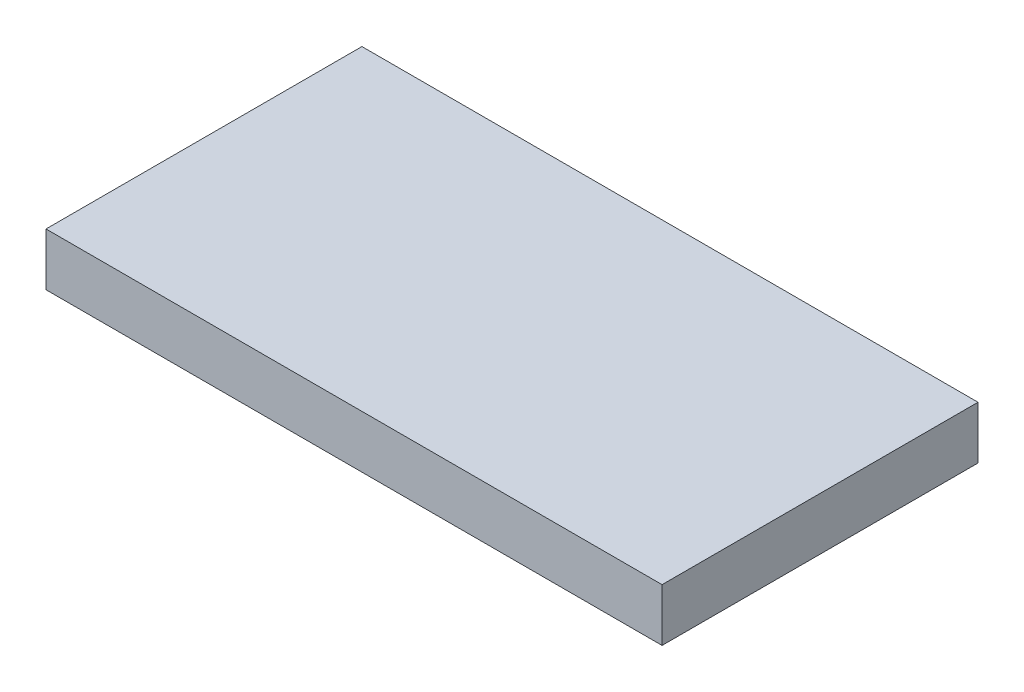
ISO-10303-21;
HEADER;
FILE_DESCRIPTION(('STEP AP214'),'2;1');
FILE_NAME('part.step','',(''),(''),'','','');
FILE_SCHEMA(('AUTOMOTIVE_DESIGN { 1 0 10303 214 1 1 1 1 }'));
ENDSEC;
DATA;
#1=APPLICATION_CONTEXT('core data for automotive mechanical design processes');
#2=APPLICATION_PROTOCOL_DEFINITION('international standard','automotive_design',2000,#1);
#3=PRODUCT_CONTEXT('',#1,'mechanical');
#4=PRODUCT('Part','Part','',(#3));
#5=PRODUCT_RELATED_PRODUCT_CATEGORY('part','',(#4));
#6=PRODUCT_DEFINITION_FORMATION('','',#4);
#7=PRODUCT_DEFINITION_CONTEXT('part definition',#1,'design');
#8=PRODUCT_DEFINITION('design','',#6,#7);
#9=PRODUCT_DEFINITION_SHAPE('','',#8);
#10=(LENGTH_UNIT() NAMED_UNIT(*) SI_UNIT(.MILLI.,.METRE.));
#11=(NAMED_UNIT(*) PLANE_ANGLE_UNIT() SI_UNIT($,.RADIAN.));
#12=(NAMED_UNIT(*) SI_UNIT($,.STERADIAN.) SOLID_ANGLE_UNIT());
#13=UNCERTAINTY_MEASURE_WITH_UNIT(LENGTH_MEASURE(1.E-05),#10,'distance_accuracy_value','');
#14=(GEOMETRIC_REPRESENTATION_CONTEXT(3) GLOBAL_UNCERTAINTY_ASSIGNED_CONTEXT((#13)) GLOBAL_UNIT_ASSIGNED_CONTEXT((#10,
#11,#12)) REPRESENTATION_CONTEXT('',''));
#15=CARTESIAN_POINT('',(0.,0.,0.));
#16=DIRECTION('',(0.,0.,1.));
#17=DIRECTION('',(1.,0.,0.));
#18=AXIS2_PLACEMENT_3D('',#15,#16,#17);
#19=CARTESIAN_POINT('',(0.,2.,0.));
#20=DIRECTION('',(1.,0.,0.));
#21=DIRECTION('',(0.,0.,-1.));
#22=AXIS2_PLACEMENT_3D('',#19,#20,#21);
#23=PLANE('',#22);
#24=DIRECTION('',(0.,0.,1.));
#25=VECTOR('',#24,1.);
#26=CARTESIAN_POINT('',(0.,0.,0.));
#27=LINE('',#26,#25);
#28=CARTESIAN_POINT('',(0.,0.,0.));
#29=VERTEX_POINT('',#28);
#30=CARTESIAN_POINT('',(0.,0.,12.));
#31=VERTEX_POINT('',#30);
#32=EDGE_CURVE('E96',#29,#31,#27,.T.);
#33=ORIENTED_EDGE('',*,*,#32,.T.);
#34=DIRECTION('',(0.,-1.,0.));
#35=VECTOR('',#34,1.);
#36=CARTESIAN_POINT('',(0.,2.,12.));
#37=LINE('',#36,#35);
#38=CARTESIAN_POINT('',(0.,2.,12.));
#39=VERTEX_POINT('',#38);
#40=EDGE_CURVE('E11',#39,#31,#37,.T.);
#41=ORIENTED_EDGE('',*,*,#40,.F.);
#42=DIRECTION('',(0.,0.,1.));
#43=VECTOR('',#42,1.);
#44=CARTESIAN_POINT('',(0.,2.,0.));
#45=LINE('',#44,#43);
#46=CARTESIAN_POINT('',(0.,2.,0.));
#47=VERTEX_POINT('',#46);
#48=EDGE_CURVE('E84',#47,#39,#45,.T.);
#49=ORIENTED_EDGE('',*,*,#48,.F.);
#50=DIRECTION('',(0.,-1.,0.));
#51=VECTOR('',#50,1.);
#52=CARTESIAN_POINT('',(0.,2.,0.));
#53=LINE('',#52,#51);
#54=EDGE_CURVE('E92',#47,#29,#53,.T.);
#55=ORIENTED_EDGE('',*,*,#54,.T.);
#56=EDGE_LOOP('',(#33,#41,#49,#55));
#57=FACE_BOUND('',#56,.T.);
#58=ADVANCED_FACE('F33',(#57),#23,.F.);
#59=CARTESIAN_POINT('',(0.,2.,12.));
#60=DIRECTION('',(0.,0.,-1.));
#61=DIRECTION('',(-1.,0.,0.));
#62=AXIS2_PLACEMENT_3D('',#59,#60,#61);
#63=PLANE('',#62);
#64=DIRECTION('',(1.,0.,0.));
#65=VECTOR('',#64,1.);
#66=CARTESIAN_POINT('',(0.,0.,12.));
#67=LINE('',#66,#65);
#68=CARTESIAN_POINT('',(23.4,0.,12.));
#69=VERTEX_POINT('',#68);
#70=EDGE_CURVE('E88',#31,#69,#67,.T.);
#71=ORIENTED_EDGE('',*,*,#70,.T.);
#72=DIRECTION('',(0.,-1.,0.));
#73=VECTOR('',#72,1.);
#74=CARTESIAN_POINT('',(23.4,2.,12.));
#75=LINE('',#74,#73);
#76=CARTESIAN_POINT('',(23.4,2.,12.));
#77=VERTEX_POINT('',#76);
#78=EDGE_CURVE('E41',#77,#69,#75,.T.);
#79=ORIENTED_EDGE('',*,*,#78,.F.);
#80=DIRECTION('',(1.,0.,0.));
#81=VECTOR('',#80,1.);
#82=CARTESIAN_POINT('',(0.,2.,12.));
#83=LINE('',#82,#81);
#84=EDGE_CURVE('E79',#39,#77,#83,.T.);
#85=ORIENTED_EDGE('',*,*,#84,.F.);
#86=ORIENTED_EDGE('',*,*,#40,.T.);
#87=EDGE_LOOP('',(#71,#79,#85,#86));
#88=FACE_BOUND('',#87,.T.);
#89=ADVANCED_FACE('F87',(#88),#63,.F.);
#90=CARTESIAN_POINT('',(23.4,2.,0.));
#91=DIRECTION('',(-1.,0.,0.));
#92=DIRECTION('',(0.,0.,1.));
#93=AXIS2_PLACEMENT_3D('',#90,#91,#92);
#94=PLANE('',#93);
#95=DIRECTION('',(0.,0.,-1.));
#96=VECTOR('',#95,1.);
#97=CARTESIAN_POINT('',(23.4,0.,0.));
#98=LINE('',#97,#96);
#99=CARTESIAN_POINT('',(23.4,0.,0.));
#100=VERTEX_POINT('',#99);
#101=EDGE_CURVE('E66',#69,#100,#98,.T.);
#102=ORIENTED_EDGE('',*,*,#101,.T.);
#103=DIRECTION('',(0.,-1.,0.));
#104=VECTOR('',#103,1.);
#105=CARTESIAN_POINT('',(23.4,2.,0.));
#106=LINE('',#105,#104);
#107=CARTESIAN_POINT('',(23.4,2.,0.));
#108=VERTEX_POINT('',#107);
#109=EDGE_CURVE('E89',#108,#100,#106,.T.);
#110=ORIENTED_EDGE('',*,*,#109,.F.);
#111=DIRECTION('',(0.,0.,-1.));
#112=VECTOR('',#111,1.);
#113=CARTESIAN_POINT('',(23.4,2.,0.));
#114=LINE('',#113,#112);
#115=EDGE_CURVE('E82',#77,#108,#114,.T.);
#116=ORIENTED_EDGE('',*,*,#115,.F.);
#117=ORIENTED_EDGE('',*,*,#78,.T.);
#118=EDGE_LOOP('',(#102,#110,#116,#117));
#119=FACE_BOUND('',#118,.T.);
#120=ADVANCED_FACE('F90',(#119),#94,.F.);
#121=CARTESIAN_POINT('',(0.,2.,0.));
#122=DIRECTION('',(0.,0.,1.));
#123=DIRECTION('',(1.,0.,0.));
#124=AXIS2_PLACEMENT_3D('',#121,#122,#123);
#125=PLANE('',#124);
#126=DIRECTION('',(-1.,0.,0.));
#127=VECTOR('',#126,1.);
#128=CARTESIAN_POINT('',(0.,0.,0.));
#129=LINE('',#128,#127);
#130=EDGE_CURVE('E72',#100,#29,#129,.T.);
#131=ORIENTED_EDGE('',*,*,#130,.T.);
#132=ORIENTED_EDGE('',*,*,#54,.F.);
#133=DIRECTION('',(-1.,0.,0.));
#134=VECTOR('',#133,1.);
#135=CARTESIAN_POINT('',(0.,2.,0.));
#136=LINE('',#135,#134);
#137=EDGE_CURVE('E49',#108,#47,#136,.T.);
#138=ORIENTED_EDGE('',*,*,#137,.F.);
#139=ORIENTED_EDGE('',*,*,#109,.T.);
#140=EDGE_LOOP('',(#131,#132,#138,#139));
#141=FACE_BOUND('',#140,.T.);
#142=ADVANCED_FACE('F103',(#141),#125,.F.);
#143=CARTESIAN_POINT('',(0.,2.,0.));
#144=DIRECTION('',(0.,1.,0.));
#145=DIRECTION('',(0.,0.,1.));
#146=AXIS2_PLACEMENT_3D('',#143,#144,#145);
#147=PLANE('',#146);
#148=ORIENTED_EDGE('',*,*,#48,.T.);
#149=ORIENTED_EDGE('',*,*,#84,.T.);
#150=ORIENTED_EDGE('',*,*,#115,.T.);
#151=ORIENTED_EDGE('',*,*,#137,.T.);
#152=EDGE_LOOP('',(#148,#149,#150,#151));
#153=FACE_BOUND('',#152,.T.);
#154=ADVANCED_FACE('F80',(#153),#147,.T.);
#155=CARTESIAN_POINT('',(0.,0.,0.));
#156=DIRECTION('',(0.,1.,0.));
#157=DIRECTION('',(0.,0.,1.));
#158=AXIS2_PLACEMENT_3D('',#155,#156,#157);
#159=PLANE('',#158);
#160=ORIENTED_EDGE('',*,*,#32,.F.);
#161=ORIENTED_EDGE('',*,*,#130,.F.);
#162=ORIENTED_EDGE('',*,*,#101,.F.);
#163=ORIENTED_EDGE('',*,*,#70,.F.);
#164=EDGE_LOOP('',(#160,#161,#162,#163));
#165=FACE_BOUND('',#164,.T.);
#166=ADVANCED_FACE('F106',(#165),#159,.F.);
#167=CLOSED_SHELL('',(#58,#89,#120,#142,#154,#166));
#168=MANIFOLD_SOLID_BREP('B2',#167);
#169=ADVANCED_BREP_SHAPE_REPRESENTATION('',(#18,#168),#14);
#170=SHAPE_DEFINITION_REPRESENTATION(#9,#169);
ENDSEC;
END-ISO-10303-21;
